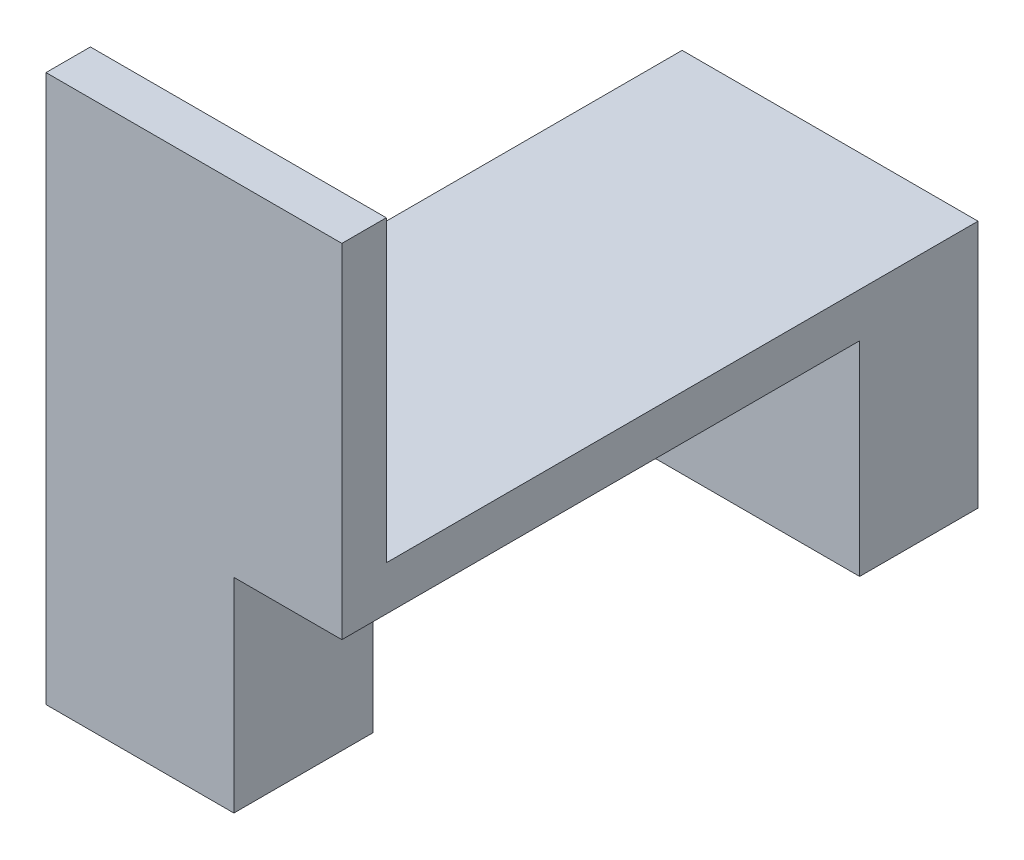
ISO-10303-21;
HEADER;
FILE_DESCRIPTION(('STEP AP214'),'2;1');
FILE_NAME('part.step','',(''),(''),'','','');
FILE_SCHEMA(('AUTOMOTIVE_DESIGN { 1 0 10303 214 1 1 1 1 }'));
ENDSEC;
DATA;
#1=APPLICATION_CONTEXT('core data for automotive mechanical design processes');
#2=APPLICATION_PROTOCOL_DEFINITION('international standard','automotive_design',2000,#1);
#3=PRODUCT_CONTEXT('',#1,'mechanical');
#4=PRODUCT('Part','Part','',(#3));
#5=PRODUCT_RELATED_PRODUCT_CATEGORY('part','',(#4));
#6=PRODUCT_DEFINITION_FORMATION('','',#4);
#7=PRODUCT_DEFINITION_CONTEXT('part definition',#1,'design');
#8=PRODUCT_DEFINITION('design','',#6,#7);
#9=PRODUCT_DEFINITION_SHAPE('','',#8);
#10=(LENGTH_UNIT() NAMED_UNIT(*) SI_UNIT(.MILLI.,.METRE.));
#11=(NAMED_UNIT(*) PLANE_ANGLE_UNIT() SI_UNIT($,.RADIAN.));
#12=(NAMED_UNIT(*) SI_UNIT($,.STERADIAN.) SOLID_ANGLE_UNIT());
#13=UNCERTAINTY_MEASURE_WITH_UNIT(LENGTH_MEASURE(1.E-05),#10,'distance_accuracy_value','');
#14=(GEOMETRIC_REPRESENTATION_CONTEXT(3) GLOBAL_UNCERTAINTY_ASSIGNED_CONTEXT((#13)) GLOBAL_UNIT_ASSIGNED_CONTEXT((#10,
#11,#12)) REPRESENTATION_CONTEXT('',''));
#15=CARTESIAN_POINT('',(0.,0.,0.));
#16=DIRECTION('',(0.,0.,1.));
#17=DIRECTION('',(1.,0.,0.));
#18=AXIS2_PLACEMENT_3D('',#15,#16,#17);
#19=CARTESIAN_POINT('',(-10.,0.,0.));
#20=DIRECTION('',(0.,-1.,0.));
#21=DIRECTION('',(0.,0.,-1.));
#22=AXIS2_PLACEMENT_3D('',#19,#20,#21);
#23=PLANE('',#22);
#24=CARTESIAN_POINT('',(-5.8,0.,13.65));
#25=DIRECTION('',(0.,-1.,0.));
#26=DIRECTION('',(0.,0.,-1.));
#27=AXIS2_PLACEMENT_3D('',#24,#25,#26);
#28=CIRCLE('',#27,0.85);
#29=CARTESIAN_POINT('',(-5.8,0.,12.8));
#30=VERTEX_POINT('',#29);
#31=EDGE_CURVE('E11',#30,#30,#28,.T.);
#32=ORIENTED_EDGE('',*,*,#31,.F.);
#33=EDGE_LOOP('',(#32));
#34=FACE_BOUND('',#33,.T.);
#35=CARTESIAN_POINT('',(-5.8,0.,7.14999999999998));
#36=DIRECTION('',(0.,-1.,0.));
#37=DIRECTION('',(0.,0.,-1.));
#38=AXIS2_PLACEMENT_3D('',#35,#36,#37);
#39=CIRCLE('',#38,0.85);
#40=CARTESIAN_POINT('',(-5.8,0.,6.29999999999998));
#41=VERTEX_POINT('',#40);
#42=EDGE_CURVE('E44',#41,#41,#39,.T.);
#43=ORIENTED_EDGE('',*,*,#42,.F.);
#44=EDGE_LOOP('',(#43));
#45=FACE_BOUND('',#44,.T.);
#46=DIRECTION('',(-1.,0.,0.));
#47=VECTOR('',#46,1.);
#48=CARTESIAN_POINT('',(-7.5,0.,16.8));
#49=LINE('',#48,#47);
#50=CARTESIAN_POINT('',(-3.65,0.,16.8));
#51=VERTEX_POINT('',#50);
#52=CARTESIAN_POINT('',(-7.5,0.,16.8));
#53=VERTEX_POINT('',#52);
#54=EDGE_CURVE('E160',#51,#53,#49,.T.);
#55=ORIENTED_EDGE('',*,*,#54,.T.);
#56=DIRECTION('',(0.,0.,-1.));
#57=VECTOR('',#56,1.);
#58=CARTESIAN_POINT('',(-7.5,0.,21.5));
#59=LINE('',#58,#57);
#60=CARTESIAN_POINT('',(-7.49999999999999,0.,3.99999999999998));
#61=VERTEX_POINT('',#60);
#62=EDGE_CURVE('E217',#53,#61,#59,.T.);
#63=ORIENTED_EDGE('',*,*,#62,.T.);
#64=DIRECTION('',(1.,0.,0.));
#65=VECTOR('',#64,1.);
#66=CARTESIAN_POINT('',(-3.65,0.,3.99999999999998));
#67=LINE('',#66,#65);
#68=CARTESIAN_POINT('',(0.,0.,3.99999999999998));
#69=VERTEX_POINT('',#68);
#70=EDGE_CURVE('E192',#61,#69,#67,.T.);
#71=ORIENTED_EDGE('',*,*,#70,.T.);
#72=DIRECTION('',(0.,0.,-1.));
#73=VECTOR('',#72,1.);
#74=CARTESIAN_POINT('',(0.,0.,0.));
#75=LINE('',#74,#73);
#76=CARTESIAN_POINT('',(0.,0.,21.5));
#77=VERTEX_POINT('',#76);
#78=EDGE_CURVE('E233',#77,#69,#75,.T.);
#79=ORIENTED_EDGE('',*,*,#78,.F.);
#80=DIRECTION('',(1.,0.,0.));
#81=VECTOR('',#80,1.);
#82=CARTESIAN_POINT('',(-10.,0.,21.5));
#83=LINE('',#82,#81);
#84=CARTESIAN_POINT('',(-3.65,0.,21.5));
#85=VERTEX_POINT('',#84);
#86=EDGE_CURVE('E83',#85,#77,#83,.T.);
#87=ORIENTED_EDGE('',*,*,#86,.F.);
#88=DIRECTION('',(0.,0.,-1.));
#89=VECTOR('',#88,1.);
#90=CARTESIAN_POINT('',(-3.65,0.,21.5));
#91=LINE('',#90,#89);
#92=EDGE_CURVE('E166',#85,#51,#91,.T.);
#93=ORIENTED_EDGE('',*,*,#92,.T.);
#94=EDGE_LOOP('',(#55,#63,#71,#79,#87,#93));
#95=FACE_BOUND('',#94,.T.);
#96=ADVANCED_FACE('F35',(#34,#45,#95),#23,.T.);
#97=CARTESIAN_POINT('',(-10.,1.5,0.));
#98=DIRECTION('',(0.,0.,-1.));
#99=DIRECTION('',(0.,1.,0.));
#100=AXIS2_PLACEMENT_3D('',#97,#98,#99);
#101=PLANE('',#100);
#102=DIRECTION('',(0.,1.,0.));
#103=VECTOR('',#102,1.);
#104=CARTESIAN_POINT('',(-10.,1.5,0.));
#105=LINE('',#104,#103);
#106=CARTESIAN_POINT('',(-10.,-6.90000000000001,0.));
#107=VERTEX_POINT('',#106);
#108=CARTESIAN_POINT('',(-10.,1.5,0.));
#109=VERTEX_POINT('',#108);
#110=EDGE_CURVE('E90',#107,#109,#105,.T.);
#111=ORIENTED_EDGE('',*,*,#110,.T.);
#112=DIRECTION('',(1.,0.,0.));
#113=VECTOR('',#112,1.);
#114=CARTESIAN_POINT('',(-10.,1.5,0.));
#115=LINE('',#114,#113);
#116=CARTESIAN_POINT('',(0.,1.5,0.));
#117=VERTEX_POINT('',#116);
#118=EDGE_CURVE('E243',#109,#117,#115,.T.);
#119=ORIENTED_EDGE('',*,*,#118,.T.);
#120=DIRECTION('',(0.,1.,0.));
#121=VECTOR('',#120,1.);
#122=CARTESIAN_POINT('',(0.,1.5,0.));
#123=LINE('',#122,#121);
#124=CARTESIAN_POINT('',(0.,-6.90000000000001,0.));
#125=VERTEX_POINT('',#124);
#126=EDGE_CURVE('E228',#125,#117,#123,.T.);
#127=ORIENTED_EDGE('',*,*,#126,.F.);
#128=DIRECTION('',(-1.,0.,0.));
#129=VECTOR('',#128,1.);
#130=CARTESIAN_POINT('',(-7.49999999999999,-6.90000000000001,0.));
#131=LINE('',#130,#129);
#132=EDGE_CURVE('E198',#125,#107,#131,.T.);
#133=ORIENTED_EDGE('',*,*,#132,.T.);
#134=EDGE_LOOP('',(#111,#119,#127,#133));
#135=FACE_BOUND('',#134,.T.);
#136=ADVANCED_FACE('F37',(#135),#101,.T.);
#137=CARTESIAN_POINT('',(-10.,0.,21.5));
#138=DIRECTION('',(0.,0.,1.));
#139=DIRECTION('',(0.,-1.,0.));
#140=AXIS2_PLACEMENT_3D('',#137,#138,#139);
#141=PLANE('',#140);
#142=DIRECTION('',(0.,1.,0.));
#143=VECTOR('',#142,1.);
#144=CARTESIAN_POINT('',(-3.65,-6.90000000000001,21.5));
#145=LINE('',#144,#143);
#146=CARTESIAN_POINT('',(-3.65,-6.90000000000001,21.5));
#147=VERTEX_POINT('',#146);
#148=EDGE_CURVE('E152',#147,#85,#145,.T.);
#149=ORIENTED_EDGE('',*,*,#148,.T.);
#150=ORIENTED_EDGE('',*,*,#86,.T.);
#151=DIRECTION('',(0.,-1.,0.));
#152=VECTOR('',#151,1.);
#153=CARTESIAN_POINT('',(0.,0.,21.5));
#154=LINE('',#153,#152);
#155=CARTESIAN_POINT('',(0.,11.6,21.5));
#156=VERTEX_POINT('',#155);
#157=EDGE_CURVE('E255',#156,#77,#154,.T.);
#158=ORIENTED_EDGE('',*,*,#157,.F.);
#159=DIRECTION('',(1.,0.,0.));
#160=VECTOR('',#159,1.);
#161=CARTESIAN_POINT('',(-10.,11.6,21.5));
#162=LINE('',#161,#160);
#163=CARTESIAN_POINT('',(-10.,11.6,21.5));
#164=VERTEX_POINT('',#163);
#165=EDGE_CURVE('E60',#164,#156,#162,.T.);
#166=ORIENTED_EDGE('',*,*,#165,.F.);
#167=DIRECTION('',(0.,-1.,0.));
#168=VECTOR('',#167,1.);
#169=CARTESIAN_POINT('',(-10.,0.,21.5));
#170=LINE('',#169,#168);
#171=CARTESIAN_POINT('',(-10.,-6.90000000000001,21.5));
#172=VERTEX_POINT('',#171);
#173=EDGE_CURVE('E154',#164,#172,#170,.T.);
#174=ORIENTED_EDGE('',*,*,#173,.T.);
#175=DIRECTION('',(1.,0.,0.));
#176=VECTOR('',#175,1.);
#177=CARTESIAN_POINT('',(-7.5,-6.90000000000001,21.5));
#178=LINE('',#177,#176);
#179=EDGE_CURVE('E149',#172,#147,#178,.T.);
#180=ORIENTED_EDGE('',*,*,#179,.T.);
#181=EDGE_LOOP('',(#149,#150,#158,#166,#174,#180));
#182=FACE_BOUND('',#181,.T.);
#183=ADVANCED_FACE('F151',(#182),#141,.T.);
#184=CARTESIAN_POINT('',(-10.,11.6,21.5));
#185=DIRECTION('',(0.,1.,0.));
#186=DIRECTION('',(0.,0.,1.));
#187=AXIS2_PLACEMENT_3D('',#184,#185,#186);
#188=PLANE('',#187);
#189=DIRECTION('',(0.,0.,1.));
#190=VECTOR('',#189,1.);
#191=CARTESIAN_POINT('',(0.,11.6,21.5));
#192=LINE('',#191,#190);
#193=CARTESIAN_POINT('',(0.,11.6,20.));
#194=VERTEX_POINT('',#193);
#195=EDGE_CURVE('E252',#194,#156,#192,.T.);
#196=ORIENTED_EDGE('',*,*,#195,.F.);
#197=DIRECTION('',(1.,0.,0.));
#198=VECTOR('',#197,1.);
#199=CARTESIAN_POINT('',(-10.,11.6,20.));
#200=LINE('',#199,#198);
#201=CARTESIAN_POINT('',(-10.,11.6,20.));
#202=VERTEX_POINT('',#201);
#203=EDGE_CURVE('E262',#202,#194,#200,.T.);
#204=ORIENTED_EDGE('',*,*,#203,.F.);
#205=DIRECTION('',(0.,0.,1.));
#206=VECTOR('',#205,1.);
#207=CARTESIAN_POINT('',(-10.,11.6,21.5));
#208=LINE('',#207,#206);
#209=EDGE_CURVE('E239',#202,#164,#208,.T.);
#210=ORIENTED_EDGE('',*,*,#209,.T.);
#211=ORIENTED_EDGE('',*,*,#165,.T.);
#212=EDGE_LOOP('',(#196,#204,#210,#211));
#213=FACE_BOUND('',#212,.T.);
#214=ADVANCED_FACE('F303',(#213),#188,.T.);
#215=CARTESIAN_POINT('',(-10.,1.5,20.));
#216=DIRECTION('',(0.,0.,-1.));
#217=DIRECTION('',(-1.,0.,0.));
#218=AXIS2_PLACEMENT_3D('',#215,#216,#217);
#219=PLANE('',#218);
#220=DIRECTION('',(0.,1.,0.));
#221=VECTOR('',#220,1.);
#222=CARTESIAN_POINT('',(0.,1.5,20.));
#223=LINE('',#222,#221);
#224=CARTESIAN_POINT('',(0.,1.5,20.));
#225=VERTEX_POINT('',#224);
#226=EDGE_CURVE('E249',#225,#194,#223,.T.);
#227=ORIENTED_EDGE('',*,*,#226,.F.);
#228=DIRECTION('',(1.,0.,0.));
#229=VECTOR('',#228,1.);
#230=CARTESIAN_POINT('',(-10.,1.5,20.));
#231=LINE('',#230,#229);
#232=CARTESIAN_POINT('',(-10.,1.5,20.));
#233=VERTEX_POINT('',#232);
#234=EDGE_CURVE('E264',#233,#225,#231,.T.);
#235=ORIENTED_EDGE('',*,*,#234,.F.);
#236=DIRECTION('',(0.,1.,0.));
#237=VECTOR('',#236,1.);
#238=CARTESIAN_POINT('',(-10.,1.5,20.));
#239=LINE('',#238,#237);
#240=EDGE_CURVE('E236',#233,#202,#239,.T.);
#241=ORIENTED_EDGE('',*,*,#240,.T.);
#242=ORIENTED_EDGE('',*,*,#203,.T.);
#243=EDGE_LOOP('',(#227,#235,#241,#242));
#244=FACE_BOUND('',#243,.T.);
#245=ADVANCED_FACE('F309',(#244),#219,.T.);
#246=CARTESIAN_POINT('',(-10.,1.5,0.));
#247=DIRECTION('',(0.,1.,0.));
#248=DIRECTION('',(0.,0.,1.));
#249=AXIS2_PLACEMENT_3D('',#246,#247,#248);
#250=PLANE('',#249);
#251=DIRECTION('',(0.,0.,1.));
#252=VECTOR('',#251,1.);
#253=CARTESIAN_POINT('',(0.,1.5,0.));
#254=LINE('',#253,#252);
#255=EDGE_CURVE('E246',#117,#225,#254,.T.);
#256=ORIENTED_EDGE('',*,*,#255,.F.);
#257=ORIENTED_EDGE('',*,*,#118,.F.);
#258=DIRECTION('',(0.,0.,1.));
#259=VECTOR('',#258,1.);
#260=CARTESIAN_POINT('',(-10.,1.5,0.));
#261=LINE('',#260,#259);
#262=EDGE_CURVE('E232',#109,#233,#261,.T.);
#263=ORIENTED_EDGE('',*,*,#262,.T.);
#264=ORIENTED_EDGE('',*,*,#234,.T.);
#265=EDGE_LOOP('',(#256,#257,#263,#264));
#266=FACE_BOUND('',#265,.T.);
#267=ADVANCED_FACE('F312',(#266),#250,.T.);
#268=CARTESIAN_POINT('',(-10.,0.,0.));
#269=DIRECTION('',(-1.,0.,0.));
#270=DIRECTION('',(0.,0.,1.));
#271=AXIS2_PLACEMENT_3D('',#268,#269,#270);
#272=PLANE('',#271);
#273=DIRECTION('',(0.,0.,1.));
#274=VECTOR('',#273,1.);
#275=CARTESIAN_POINT('',(-10.,-1.5,21.5));
#276=LINE('',#275,#274);
#277=CARTESIAN_POINT('',(-10.,-1.5,4.74999999999998));
#278=VERTEX_POINT('',#277);
#279=CARTESIAN_POINT('',(-10.,-1.5,16.05));
#280=VERTEX_POINT('',#279);
#281=EDGE_CURVE('E223',#278,#280,#276,.T.);
#282=ORIENTED_EDGE('',*,*,#281,.T.);
#283=DIRECTION('',(0.,1.,0.));
#284=VECTOR('',#283,1.);
#285=CARTESIAN_POINT('',(-10.,-6.90000000000001,16.05));
#286=LINE('',#285,#284);
#287=CARTESIAN_POINT('',(-10.,-6.90000000000001,16.05));
#288=VERTEX_POINT('',#287);
#289=EDGE_CURVE('E190',#288,#280,#286,.T.);
#290=ORIENTED_EDGE('',*,*,#289,.F.);
#291=DIRECTION('',(0.,0.,1.));
#292=VECTOR('',#291,1.);
#293=CARTESIAN_POINT('',(-10.,-6.90000000000001,21.5));
#294=LINE('',#293,#292);
#295=EDGE_CURVE('E168',#288,#172,#294,.T.);
#296=ORIENTED_EDGE('',*,*,#295,.T.);
#297=ORIENTED_EDGE('',*,*,#173,.F.);
#298=ORIENTED_EDGE('',*,*,#209,.F.);
#299=ORIENTED_EDGE('',*,*,#240,.F.);
#300=ORIENTED_EDGE('',*,*,#262,.F.);
#301=ORIENTED_EDGE('',*,*,#110,.F.);
#302=DIRECTION('',(0.,0.,1.));
#303=VECTOR('',#302,1.);
#304=CARTESIAN_POINT('',(-10.,-6.90000000000001,0.));
#305=LINE('',#304,#303);
#306=CARTESIAN_POINT('',(-10.,-6.90000000000001,4.74999999999998));
#307=VERTEX_POINT('',#306);
#308=EDGE_CURVE('E200',#107,#307,#305,.T.);
#309=ORIENTED_EDGE('',*,*,#308,.T.);
#310=DIRECTION('',(0.,1.,0.));
#311=VECTOR('',#310,1.);
#312=CARTESIAN_POINT('',(-10.,-6.90000000000001,4.74999999999998));
#313=LINE('',#312,#311);
#314=EDGE_CURVE('E51',#307,#278,#313,.T.);
#315=ORIENTED_EDGE('',*,*,#314,.T.);
#316=EDGE_LOOP('',(#282,#290,#296,#297,#298,#299,#300,#301,#309,#315));
#317=FACE_BOUND('',#316,.T.);
#318=ADVANCED_FACE('F306',(#317),#272,.T.);
#319=CARTESIAN_POINT('',(0.,0.,0.));
#320=DIRECTION('',(-1.,0.,0.));
#321=DIRECTION('',(0.,0.,1.));
#322=AXIS2_PLACEMENT_3D('',#319,#320,#321);
#323=PLANE('',#322);
#324=ORIENTED_EDGE('',*,*,#126,.T.);
#325=ORIENTED_EDGE('',*,*,#255,.T.);
#326=ORIENTED_EDGE('',*,*,#226,.T.);
#327=ORIENTED_EDGE('',*,*,#195,.T.);
#328=ORIENTED_EDGE('',*,*,#157,.T.);
#329=ORIENTED_EDGE('',*,*,#78,.T.);
#330=DIRECTION('',(0.,1.,0.));
#331=VECTOR('',#330,1.);
#332=CARTESIAN_POINT('',(0.,-6.90000000000001,3.99999999999998));
#333=LINE('',#332,#331);
#334=CARTESIAN_POINT('',(0.,-6.90000000000001,3.99999999999998));
#335=VERTEX_POINT('',#334);
#336=EDGE_CURVE('E215',#335,#69,#333,.T.);
#337=ORIENTED_EDGE('',*,*,#336,.F.);
#338=DIRECTION('',(0.,0.,-1.));
#339=VECTOR('',#338,1.);
#340=CARTESIAN_POINT('',(0.,-6.90000000000001,3.99999999999998));
#341=LINE('',#340,#339);
#342=EDGE_CURVE('E210',#335,#125,#341,.T.);
#343=ORIENTED_EDGE('',*,*,#342,.T.);
#344=EDGE_LOOP('',(#324,#325,#326,#327,#328,#329,#337,#343));
#345=FACE_BOUND('',#344,.T.);
#346=ADVANCED_FACE('F298',(#345),#323,.F.);
#347=CARTESIAN_POINT('',(-7.5,-1.5,21.5));
#348=DIRECTION('',(1.,0.,0.));
#349=DIRECTION('',(0.,0.,-1.));
#350=AXIS2_PLACEMENT_3D('',#347,#348,#349);
#351=PLANE('',#350);
#352=DIRECTION('',(0.,0.,-1.));
#353=VECTOR('',#352,1.);
#354=CARTESIAN_POINT('',(-7.5,-1.5,21.5));
#355=LINE('',#354,#353);
#356=CARTESIAN_POINT('',(-7.5,-1.5,16.05));
#357=VERTEX_POINT('',#356);
#358=CARTESIAN_POINT('',(-7.5,-1.5,4.74999999999998));
#359=VERTEX_POINT('',#358);
#360=EDGE_CURVE('E225',#357,#359,#355,.T.);
#361=ORIENTED_EDGE('',*,*,#360,.T.);
#362=DIRECTION('',(0.,1.,0.));
#363=VECTOR('',#362,1.);
#364=CARTESIAN_POINT('',(-7.5,-6.90000000000001,4.74999999999998));
#365=LINE('',#364,#363);
#366=CARTESIAN_POINT('',(-7.5,-6.90000000000001,4.74999999999998));
#367=VERTEX_POINT('',#366);
#368=EDGE_CURVE('E220',#367,#359,#365,.T.);
#369=ORIENTED_EDGE('',*,*,#368,.F.);
#370=DIRECTION('',(0.,0.,-1.));
#371=VECTOR('',#370,1.);
#372=CARTESIAN_POINT('',(-7.5,-6.90000000000001,4.74999999999998));
#373=LINE('',#372,#371);
#374=CARTESIAN_POINT('',(-7.49999999999999,-6.90000000000001,3.99999999999998));
#375=VERTEX_POINT('',#374);
#376=EDGE_CURVE('E205',#367,#375,#373,.T.);
#377=ORIENTED_EDGE('',*,*,#376,.T.);
#378=DIRECTION('',(0.,1.,0.));
#379=VECTOR('',#378,1.);
#380=CARTESIAN_POINT('',(-7.49999999999999,-6.90000000000001,3.99999999999998));
#381=LINE('',#380,#379);
#382=EDGE_CURVE('E218',#375,#61,#381,.T.);
#383=ORIENTED_EDGE('',*,*,#382,.T.);
#384=ORIENTED_EDGE('',*,*,#62,.F.);
#385=DIRECTION('',(0.,1.,0.));
#386=VECTOR('',#385,1.);
#387=CARTESIAN_POINT('',(-7.5,-6.90000000000001,16.8));
#388=LINE('',#387,#386);
#389=CARTESIAN_POINT('',(-7.5,-6.90000000000001,16.8));
#390=VERTEX_POINT('',#389);
#391=EDGE_CURVE('E195',#390,#53,#388,.T.);
#392=ORIENTED_EDGE('',*,*,#391,.F.);
#393=DIRECTION('',(0.,0.,-1.));
#394=VECTOR('',#393,1.);
#395=CARTESIAN_POINT('',(-7.5,-6.90000000000001,16.05));
#396=LINE('',#395,#394);
#397=CARTESIAN_POINT('',(-7.5,-6.90000000000001,16.05));
#398=VERTEX_POINT('',#397);
#399=EDGE_CURVE('E176',#390,#398,#396,.T.);
#400=ORIENTED_EDGE('',*,*,#399,.T.);
#401=DIRECTION('',(0.,1.,0.));
#402=VECTOR('',#401,1.);
#403=CARTESIAN_POINT('',(-7.5,-6.90000000000001,16.05));
#404=LINE('',#403,#402);
#405=EDGE_CURVE('E193',#398,#357,#404,.T.);
#406=ORIENTED_EDGE('',*,*,#405,.T.);
#407=EDGE_LOOP('',(#361,#369,#377,#383,#384,#392,#400,#406));
#408=FACE_BOUND('',#407,.T.);
#409=ADVANCED_FACE('F285',(#408),#351,.T.);
#410=CARTESIAN_POINT('',(0.,-1.5,0.));
#411=DIRECTION('',(0.,-1.,0.));
#412=DIRECTION('',(0.,0.,-1.));
#413=AXIS2_PLACEMENT_3D('',#410,#411,#412);
#414=PLANE('',#413);
#415=DIRECTION('',(1.,0.,0.));
#416=VECTOR('',#415,1.);
#417=CARTESIAN_POINT('',(0.,-1.5,16.05));
#418=LINE('',#417,#416);
#419=EDGE_CURVE('E268',#280,#357,#418,.T.);
#420=ORIENTED_EDGE('',*,*,#419,.F.);
#421=ORIENTED_EDGE('',*,*,#281,.F.);
#422=DIRECTION('',(-1.,0.,0.));
#423=VECTOR('',#422,1.);
#424=CARTESIAN_POINT('',(0.,-1.5,4.74999999999998));
#425=LINE('',#424,#423);
#426=EDGE_CURVE('E260',#359,#278,#425,.T.);
#427=ORIENTED_EDGE('',*,*,#426,.F.);
#428=ORIENTED_EDGE('',*,*,#360,.F.);
#429=EDGE_LOOP('',(#420,#421,#427,#428));
#430=FACE_BOUND('',#429,.T.);
#431=ADVANCED_FACE('F336',(#430),#414,.T.);
#432=CARTESIAN_POINT('',(-3.65,-6.90000000000001,3.99999999999998));
#433=DIRECTION('',(0.,0.,1.));
#434=DIRECTION('',(1.,0.,0.));
#435=AXIS2_PLACEMENT_3D('',#432,#433,#434);
#436=PLANE('',#435);
#437=DIRECTION('',(1.,0.,0.));
#438=VECTOR('',#437,1.);
#439=CARTESIAN_POINT('',(-7.49999999999999,-6.90000000000001,3.99999999999998));
#440=LINE('',#439,#438);
#441=EDGE_CURVE('E208',#375,#335,#440,.T.);
#442=ORIENTED_EDGE('',*,*,#441,.T.);
#443=ORIENTED_EDGE('',*,*,#336,.T.);
#444=ORIENTED_EDGE('',*,*,#70,.F.);
#445=ORIENTED_EDGE('',*,*,#382,.F.);
#446=EDGE_LOOP('',(#442,#443,#444,#445));
#447=FACE_BOUND('',#446,.T.);
#448=ADVANCED_FACE('F289',(#447),#436,.T.);
#449=CARTESIAN_POINT('',(-10.,-6.90000000000001,4.74999999999998));
#450=DIRECTION('',(0.,0.,1.));
#451=DIRECTION('',(1.,0.,0.));
#452=AXIS2_PLACEMENT_3D('',#449,#450,#451);
#453=PLANE('',#452);
#454=ORIENTED_EDGE('',*,*,#368,.T.);
#455=ORIENTED_EDGE('',*,*,#426,.T.);
#456=ORIENTED_EDGE('',*,*,#314,.F.);
#457=DIRECTION('',(1.,0.,0.));
#458=VECTOR('',#457,1.);
#459=CARTESIAN_POINT('',(-10.,-6.90000000000001,4.74999999999998));
#460=LINE('',#459,#458);
#461=EDGE_CURVE('E202',#307,#367,#460,.T.);
#462=ORIENTED_EDGE('',*,*,#461,.T.);
#463=EDGE_LOOP('',(#454,#455,#456,#462));
#464=FACE_BOUND('',#463,.T.);
#465=ADVANCED_FACE('F340',(#464),#453,.T.);
#466=CARTESIAN_POINT('',(0.,-6.90000000000001,0.));
#467=DIRECTION('',(0.,1.,0.));
#468=DIRECTION('',(0.,0.,1.));
#469=AXIS2_PLACEMENT_3D('',#466,#467,#468);
#470=PLANE('',#469);
#471=ORIENTED_EDGE('',*,*,#132,.F.);
#472=ORIENTED_EDGE('',*,*,#342,.F.);
#473=ORIENTED_EDGE('',*,*,#441,.F.);
#474=ORIENTED_EDGE('',*,*,#376,.F.);
#475=ORIENTED_EDGE('',*,*,#461,.F.);
#476=ORIENTED_EDGE('',*,*,#308,.F.);
#477=EDGE_LOOP('',(#471,#472,#473,#474,#475,#476));
#478=FACE_BOUND('',#477,.T.);
#479=ADVANCED_FACE('F294',(#478),#470,.F.);
#480=CARTESIAN_POINT('',(-10.,-6.90000000000001,16.05));
#481=DIRECTION('',(0.,0.,-1.));
#482=DIRECTION('',(-1.,0.,0.));
#483=AXIS2_PLACEMENT_3D('',#480,#481,#482);
#484=PLANE('',#483);
#485=ORIENTED_EDGE('',*,*,#289,.T.);
#486=ORIENTED_EDGE('',*,*,#419,.T.);
#487=ORIENTED_EDGE('',*,*,#405,.F.);
#488=DIRECTION('',(-1.,0.,0.));
#489=VECTOR('',#488,1.);
#490=CARTESIAN_POINT('',(-10.,-6.90000000000001,16.05));
#491=LINE('',#490,#489);
#492=EDGE_CURVE('E182',#398,#288,#491,.T.);
#493=ORIENTED_EDGE('',*,*,#492,.T.);
#494=EDGE_LOOP('',(#485,#486,#487,#493));
#495=FACE_BOUND('',#494,.T.);
#496=ADVANCED_FACE('F348',(#495),#484,.T.);
#497=CARTESIAN_POINT('',(-7.5,-6.90000000000001,16.8));
#498=DIRECTION('',(0.,0.,-1.));
#499=DIRECTION('',(-1.,0.,0.));
#500=AXIS2_PLACEMENT_3D('',#497,#498,#499);
#501=PLANE('',#500);
#502=ORIENTED_EDGE('',*,*,#54,.F.);
#503=DIRECTION('',(0.,1.,0.));
#504=VECTOR('',#503,1.);
#505=CARTESIAN_POINT('',(-3.65,-6.90000000000001,16.8));
#506=LINE('',#505,#504);
#507=CARTESIAN_POINT('',(-3.65,-6.90000000000001,16.8));
#508=VERTEX_POINT('',#507);
#509=EDGE_CURVE('E167',#508,#51,#506,.T.);
#510=ORIENTED_EDGE('',*,*,#509,.F.);
#511=DIRECTION('',(-1.,0.,0.));
#512=VECTOR('',#511,1.);
#513=CARTESIAN_POINT('',(-7.5,-6.90000000000001,16.8));
#514=LINE('',#513,#512);
#515=EDGE_CURVE('E174',#508,#390,#514,.T.);
#516=ORIENTED_EDGE('',*,*,#515,.T.);
#517=ORIENTED_EDGE('',*,*,#391,.T.);
#518=EDGE_LOOP('',(#502,#510,#516,#517));
#519=FACE_BOUND('',#518,.T.);
#520=ADVANCED_FACE('F351',(#519),#501,.T.);
#521=CARTESIAN_POINT('',(-3.65,-6.90000000000001,21.5));
#522=DIRECTION('',(1.,0.,0.));
#523=DIRECTION('',(0.,0.,-1.));
#524=AXIS2_PLACEMENT_3D('',#521,#522,#523);
#525=PLANE('',#524);
#526=ORIENTED_EDGE('',*,*,#92,.F.);
#527=ORIENTED_EDGE('',*,*,#148,.F.);
#528=DIRECTION('',(0.,0.,-1.));
#529=VECTOR('',#528,1.);
#530=CARTESIAN_POINT('',(-3.65,-6.90000000000001,21.5));
#531=LINE('',#530,#529);
#532=EDGE_CURVE('E159',#147,#508,#531,.T.);
#533=ORIENTED_EDGE('',*,*,#532,.T.);
#534=ORIENTED_EDGE('',*,*,#509,.T.);
#535=EDGE_LOOP('',(#526,#527,#533,#534));
#536=FACE_BOUND('',#535,.T.);
#537=ADVANCED_FACE('F164',(#536),#525,.T.);
#538=CARTESIAN_POINT('',(0.,-6.90000000000001,0.));
#539=DIRECTION('',(0.,-1.,0.));
#540=DIRECTION('',(0.,0.,-1.));
#541=AXIS2_PLACEMENT_3D('',#538,#539,#540);
#542=PLANE('',#541);
#543=ORIENTED_EDGE('',*,*,#179,.F.);
#544=ORIENTED_EDGE('',*,*,#295,.F.);
#545=ORIENTED_EDGE('',*,*,#492,.F.);
#546=ORIENTED_EDGE('',*,*,#399,.F.);
#547=ORIENTED_EDGE('',*,*,#515,.F.);
#548=ORIENTED_EDGE('',*,*,#532,.F.);
#549=EDGE_LOOP('',(#543,#544,#545,#546,#547,#548));
#550=FACE_BOUND('',#549,.T.);
#551=ADVANCED_FACE('F171',(#550),#542,.T.);
#552=CARTESIAN_POINT('',(-5.8,-6.90000000000001,7.14999999999998));
#553=DIRECTION('',(0.,1.,0.));
#554=DIRECTION('',(0.,0.,1.));
#555=AXIS2_PLACEMENT_3D('',#552,#553,#554);
#556=CYLINDRICAL_SURFACE('',#555,0.85);
#557=CARTESIAN_POINT('',(-5.8,-2.,7.14999999999998));
#558=DIRECTION('',(0.,1.,0.));
#559=DIRECTION('',(0.,0.,1.));
#560=AXIS2_PLACEMENT_3D('',#557,#558,#559);
#561=CIRCLE('',#560,0.85);
#562=CARTESIAN_POINT('',(-5.8,-2.,7.99999999999998));
#563=VERTEX_POINT('',#562);
#564=EDGE_CURVE('E187',#563,#563,#561,.F.);
#565=ORIENTED_EDGE('',*,*,#564,.F.);
#566=EDGE_LOOP('',(#565));
#567=FACE_BOUND('',#566,.T.);
#568=ORIENTED_EDGE('',*,*,#42,.T.);
#569=EDGE_LOOP('',(#568));
#570=FACE_BOUND('',#569,.T.);
#571=ADVANCED_FACE('F274',(#567,#570),#556,.T.);
#572=CARTESIAN_POINT('',(-5.8,-6.90000000000001,13.65));
#573=DIRECTION('',(0.,1.,0.));
#574=DIRECTION('',(0.,0.,1.));
#575=AXIS2_PLACEMENT_3D('',#572,#573,#574);
#576=CYLINDRICAL_SURFACE('',#575,0.85);
#577=CARTESIAN_POINT('',(-5.8,-2.,13.65));
#578=DIRECTION('',(0.,1.,0.));
#579=DIRECTION('',(0.,0.,1.));
#580=AXIS2_PLACEMENT_3D('',#577,#578,#579);
#581=CIRCLE('',#580,0.85);
#582=CARTESIAN_POINT('',(-5.8,-2.,14.5));
#583=VERTEX_POINT('',#582);
#584=EDGE_CURVE('E39',#583,#583,#581,.F.);
#585=ORIENTED_EDGE('',*,*,#584,.F.);
#586=EDGE_LOOP('',(#585));
#587=FACE_BOUND('',#586,.T.);
#588=ORIENTED_EDGE('',*,*,#31,.T.);
#589=EDGE_LOOP('',(#588));
#590=FACE_BOUND('',#589,.T.);
#591=ADVANCED_FACE('F361',(#587,#590),#576,.T.);
#592=CARTESIAN_POINT('',(0.,-2.,0.));
#593=DIRECTION('',(0.,1.,0.));
#594=DIRECTION('',(0.,0.,1.));
#595=AXIS2_PLACEMENT_3D('',#592,#593,#594);
#596=PLANE('',#595);
#597=ORIENTED_EDGE('',*,*,#584,.T.);
#598=EDGE_LOOP('',(#597));
#599=FACE_BOUND('',#598,.T.);
#600=ADVANCED_FACE('F365',(#599),#596,.F.);
#601=ORIENTED_EDGE('',*,*,#564,.T.);
#602=EDGE_LOOP('',(#601));
#603=FACE_BOUND('',#602,.T.);
#604=ADVANCED_FACE('F368',(#603),#596,.F.);
#605=CLOSED_SHELL('',(#96,#136,#183,#214,#245,#267,#318,#346,#409,#431,#448,#465,#479,#496,#520,
#537,#551,#571,#591,#600,#604));
#606=MANIFOLD_SOLID_BREP('B2',#605);
#607=ADVANCED_BREP_SHAPE_REPRESENTATION('',(#18,#606),#14);
#608=SHAPE_DEFINITION_REPRESENTATION(#9,#607);
ENDSEC;
END-ISO-10303-21;
